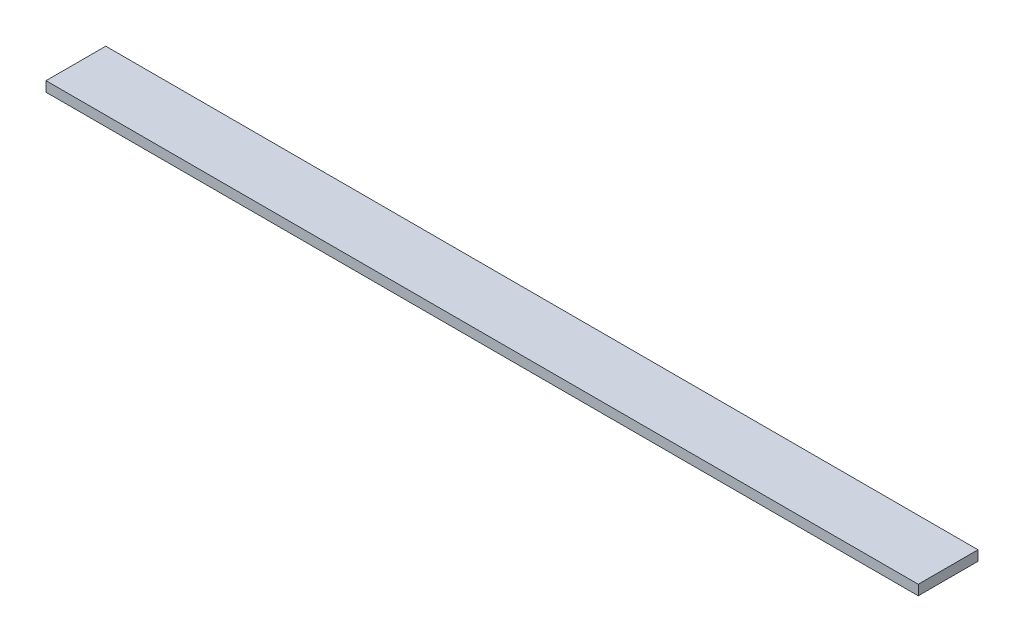
ISO-10303-21;
HEADER;
FILE_DESCRIPTION(('STEP AP214'),'2;1');
FILE_NAME('part.step','',(''),(''),'','','');
FILE_SCHEMA(('AUTOMOTIVE_DESIGN { 1 0 10303 214 1 1 1 1 }'));
ENDSEC;
DATA;
#1=APPLICATION_CONTEXT('core data for automotive mechanical design processes');
#2=APPLICATION_PROTOCOL_DEFINITION('international standard','automotive_design',2000,#1);
#3=PRODUCT_CONTEXT('',#1,'mechanical');
#4=PRODUCT('Part','Part','',(#3));
#5=PRODUCT_RELATED_PRODUCT_CATEGORY('part','',(#4));
#6=PRODUCT_DEFINITION_FORMATION('','',#4);
#7=PRODUCT_DEFINITION_CONTEXT('part definition',#1,'design');
#8=PRODUCT_DEFINITION('design','',#6,#7);
#9=PRODUCT_DEFINITION_SHAPE('','',#8);
#10=(LENGTH_UNIT() NAMED_UNIT(*) SI_UNIT(.MILLI.,.METRE.));
#11=(NAMED_UNIT(*) PLANE_ANGLE_UNIT() SI_UNIT($,.RADIAN.));
#12=(NAMED_UNIT(*) SI_UNIT($,.STERADIAN.) SOLID_ANGLE_UNIT());
#13=UNCERTAINTY_MEASURE_WITH_UNIT(LENGTH_MEASURE(1.E-05),#10,'distance_accuracy_value','');
#14=(GEOMETRIC_REPRESENTATION_CONTEXT(3) GLOBAL_UNCERTAINTY_ASSIGNED_CONTEXT((#13)) GLOBAL_UNIT_ASSIGNED_CONTEXT((#10,
#11,#12)) REPRESENTATION_CONTEXT('',''));
#15=CARTESIAN_POINT('',(0.,0.,0.));
#16=DIRECTION('',(0.,0.,1.));
#17=DIRECTION('',(1.,0.,0.));
#18=AXIS2_PLACEMENT_3D('',#15,#16,#17);
#19=CARTESIAN_POINT('',(2000.,-11.5,-68.5));
#20=DIRECTION('',(0.,0.,1.));
#21=DIRECTION('',(1.,0.,0.));
#22=AXIS2_PLACEMENT_3D('',#19,#20,#21);
#23=PLANE('',#22);
#24=DIRECTION('',(0.,1.,0.));
#25=VECTOR('',#24,1.);
#26=CARTESIAN_POINT('',(0.,-11.5,-68.5));
#27=LINE('',#26,#25);
#28=CARTESIAN_POINT('',(0.,-11.5,-68.5));
#29=VERTEX_POINT('',#28);
#30=CARTESIAN_POINT('',(0.,11.5,-68.5));
#31=VERTEX_POINT('',#30);
#32=EDGE_CURVE('E96',#29,#31,#27,.T.);
#33=ORIENTED_EDGE('',*,*,#32,.T.);
#34=DIRECTION('',(-1.,0.,0.));
#35=VECTOR('',#34,1.);
#36=CARTESIAN_POINT('',(2000.,11.5,-68.5));
#37=LINE('',#36,#35);
#38=CARTESIAN_POINT('',(2000.,11.5,-68.5));
#39=VERTEX_POINT('',#38);
#40=EDGE_CURVE('E11',#39,#31,#37,.T.);
#41=ORIENTED_EDGE('',*,*,#40,.F.);
#42=DIRECTION('',(0.,1.,0.));
#43=VECTOR('',#42,1.);
#44=CARTESIAN_POINT('',(2000.,-11.5,-68.5));
#45=LINE('',#44,#43);
#46=CARTESIAN_POINT('',(2000.,-11.5,-68.5));
#47=VERTEX_POINT('',#46);
#48=EDGE_CURVE('E84',#47,#39,#45,.T.);
#49=ORIENTED_EDGE('',*,*,#48,.F.);
#50=DIRECTION('',(-1.,0.,0.));
#51=VECTOR('',#50,1.);
#52=CARTESIAN_POINT('',(2000.,-11.5,-68.5));
#53=LINE('',#52,#51);
#54=EDGE_CURVE('E92',#47,#29,#53,.T.);
#55=ORIENTED_EDGE('',*,*,#54,.T.);
#56=EDGE_LOOP('',(#33,#41,#49,#55));
#57=FACE_BOUND('',#56,.T.);
#58=ADVANCED_FACE('F33',(#57),#23,.F.);
#59=CARTESIAN_POINT('',(2000.,11.5,68.5));
#60=DIRECTION('',(0.,-1.,0.));
#61=DIRECTION('',(0.,0.,-1.));
#62=AXIS2_PLACEMENT_3D('',#59,#60,#61);
#63=PLANE('',#62);
#64=DIRECTION('',(0.,0.,1.));
#65=VECTOR('',#64,1.);
#66=CARTESIAN_POINT('',(0.,11.5,68.5));
#67=LINE('',#66,#65);
#68=CARTESIAN_POINT('',(0.,11.5,68.5));
#69=VERTEX_POINT('',#68);
#70=EDGE_CURVE('E88',#31,#69,#67,.T.);
#71=ORIENTED_EDGE('',*,*,#70,.T.);
#72=DIRECTION('',(-1.,0.,0.));
#73=VECTOR('',#72,1.);
#74=CARTESIAN_POINT('',(2000.,11.5,68.5));
#75=LINE('',#74,#73);
#76=CARTESIAN_POINT('',(2000.,11.5,68.5));
#77=VERTEX_POINT('',#76);
#78=EDGE_CURVE('E41',#77,#69,#75,.T.);
#79=ORIENTED_EDGE('',*,*,#78,.F.);
#80=DIRECTION('',(0.,0.,1.));
#81=VECTOR('',#80,1.);
#82=CARTESIAN_POINT('',(2000.,11.5,68.5));
#83=LINE('',#82,#81);
#84=EDGE_CURVE('E79',#39,#77,#83,.T.);
#85=ORIENTED_EDGE('',*,*,#84,.F.);
#86=ORIENTED_EDGE('',*,*,#40,.T.);
#87=EDGE_LOOP('',(#71,#79,#85,#86));
#88=FACE_BOUND('',#87,.T.);
#89=ADVANCED_FACE('F87',(#88),#63,.F.);
#90=CARTESIAN_POINT('',(2000.,-11.5,68.5));
#91=DIRECTION('',(0.,0.,-1.));
#92=DIRECTION('',(-1.,0.,0.));
#93=AXIS2_PLACEMENT_3D('',#90,#91,#92);
#94=PLANE('',#93);
#95=DIRECTION('',(0.,-1.,0.));
#96=VECTOR('',#95,1.);
#97=CARTESIAN_POINT('',(0.,-11.5,68.5));
#98=LINE('',#97,#96);
#99=CARTESIAN_POINT('',(0.,-11.5,68.5));
#100=VERTEX_POINT('',#99);
#101=EDGE_CURVE('E66',#69,#100,#98,.T.);
#102=ORIENTED_EDGE('',*,*,#101,.T.);
#103=DIRECTION('',(-1.,0.,0.));
#104=VECTOR('',#103,1.);
#105=CARTESIAN_POINT('',(2000.,-11.5,68.5));
#106=LINE('',#105,#104);
#107=CARTESIAN_POINT('',(2000.,-11.5,68.5));
#108=VERTEX_POINT('',#107);
#109=EDGE_CURVE('E89',#108,#100,#106,.T.);
#110=ORIENTED_EDGE('',*,*,#109,.F.);
#111=DIRECTION('',(0.,-1.,0.));
#112=VECTOR('',#111,1.);
#113=CARTESIAN_POINT('',(2000.,-11.5,68.5));
#114=LINE('',#113,#112);
#115=EDGE_CURVE('E82',#77,#108,#114,.T.);
#116=ORIENTED_EDGE('',*,*,#115,.F.);
#117=ORIENTED_EDGE('',*,*,#78,.T.);
#118=EDGE_LOOP('',(#102,#110,#116,#117));
#119=FACE_BOUND('',#118,.T.);
#120=ADVANCED_FACE('F90',(#119),#94,.F.);
#121=CARTESIAN_POINT('',(2000.,-11.5,68.5));
#122=DIRECTION('',(0.,1.,0.));
#123=DIRECTION('',(0.,0.,1.));
#124=AXIS2_PLACEMENT_3D('',#121,#122,#123);
#125=PLANE('',#124);
#126=DIRECTION('',(0.,0.,-1.));
#127=VECTOR('',#126,1.);
#128=CARTESIAN_POINT('',(0.,-11.5,68.5));
#129=LINE('',#128,#127);
#130=EDGE_CURVE('E72',#100,#29,#129,.T.);
#131=ORIENTED_EDGE('',*,*,#130,.T.);
#132=ORIENTED_EDGE('',*,*,#54,.F.);
#133=DIRECTION('',(0.,0.,-1.));
#134=VECTOR('',#133,1.);
#135=CARTESIAN_POINT('',(2000.,-11.5,68.5));
#136=LINE('',#135,#134);
#137=EDGE_CURVE('E49',#108,#47,#136,.T.);
#138=ORIENTED_EDGE('',*,*,#137,.F.);
#139=ORIENTED_EDGE('',*,*,#109,.T.);
#140=EDGE_LOOP('',(#131,#132,#138,#139));
#141=FACE_BOUND('',#140,.T.);
#142=ADVANCED_FACE('F103',(#141),#125,.F.);
#143=CARTESIAN_POINT('',(2000.,0.,0.));
#144=DIRECTION('',(-1.,0.,0.));
#145=DIRECTION('',(0.,0.,1.));
#146=AXIS2_PLACEMENT_3D('',#143,#144,#145);
#147=PLANE('',#146);
#148=ORIENTED_EDGE('',*,*,#48,.T.);
#149=ORIENTED_EDGE('',*,*,#84,.T.);
#150=ORIENTED_EDGE('',*,*,#115,.T.);
#151=ORIENTED_EDGE('',*,*,#137,.T.);
#152=EDGE_LOOP('',(#148,#149,#150,#151));
#153=FACE_BOUND('',#152,.T.);
#154=ADVANCED_FACE('F80',(#153),#147,.F.);
#155=CARTESIAN_POINT('',(0.,0.,0.));
#156=DIRECTION('',(-1.,0.,0.));
#157=DIRECTION('',(0.,0.,1.));
#158=AXIS2_PLACEMENT_3D('',#155,#156,#157);
#159=PLANE('',#158);
#160=ORIENTED_EDGE('',*,*,#32,.F.);
#161=ORIENTED_EDGE('',*,*,#130,.F.);
#162=ORIENTED_EDGE('',*,*,#101,.F.);
#163=ORIENTED_EDGE('',*,*,#70,.F.);
#164=EDGE_LOOP('',(#160,#161,#162,#163));
#165=FACE_BOUND('',#164,.T.);
#166=ADVANCED_FACE('F106',(#165),#159,.T.);
#167=CLOSED_SHELL('',(#58,#89,#120,#142,#154,#166));
#168=MANIFOLD_SOLID_BREP('B2',#167);
#169=ADVANCED_BREP_SHAPE_REPRESENTATION('',(#18,#168),#14);
#170=SHAPE_DEFINITION_REPRESENTATION(#9,#169);
ENDSEC;
END-ISO-10303-21;
